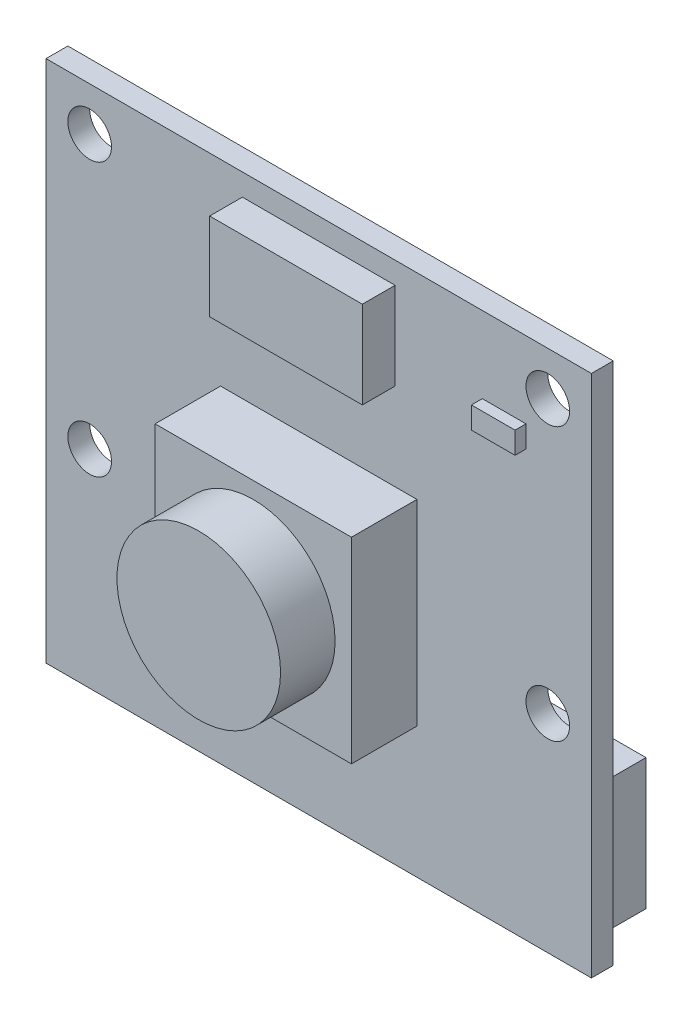
ISO-10303-21;
HEADER;
FILE_DESCRIPTION(('STEP AP214'),'2;1');
FILE_NAME('part.step','',(''),(''),'','','');
FILE_SCHEMA(('AUTOMOTIVE_DESIGN { 1 0 10303 214 1 1 1 1 }'));
ENDSEC;
DATA;
#1=APPLICATION_CONTEXT('core data for automotive mechanical design processes');
#2=APPLICATION_PROTOCOL_DEFINITION('international standard','automotive_design',2000,#1);
#3=PRODUCT_CONTEXT('',#1,'mechanical');
#4=PRODUCT('Part','Part','',(#3));
#5=PRODUCT_RELATED_PRODUCT_CATEGORY('part','',(#4));
#6=PRODUCT_DEFINITION_FORMATION('','',#4);
#7=PRODUCT_DEFINITION_CONTEXT('part definition',#1,'design');
#8=PRODUCT_DEFINITION('design','',#6,#7);
#9=PRODUCT_DEFINITION_SHAPE('','',#8);
#10=(LENGTH_UNIT() NAMED_UNIT(*) SI_UNIT(.MILLI.,.METRE.));
#11=(NAMED_UNIT(*) PLANE_ANGLE_UNIT() SI_UNIT($,.RADIAN.));
#12=(NAMED_UNIT(*) SI_UNIT($,.STERADIAN.) SOLID_ANGLE_UNIT());
#13=UNCERTAINTY_MEASURE_WITH_UNIT(LENGTH_MEASURE(1.E-05),#10,'distance_accuracy_value','');
#14=(GEOMETRIC_REPRESENTATION_CONTEXT(3) GLOBAL_UNCERTAINTY_ASSIGNED_CONTEXT((#13)) GLOBAL_UNIT_ASSIGNED_CONTEXT((#10,
#11,#12)) REPRESENTATION_CONTEXT('',''));
#15=CARTESIAN_POINT('',(0.,0.,0.));
#16=DIRECTION('',(0.,0.,1.));
#17=DIRECTION('',(1.,0.,0.));
#18=AXIS2_PLACEMENT_3D('',#15,#16,#17);
#19=CARTESIAN_POINT('',(0.,0.,0.));
#20=DIRECTION('',(0.,0.,1.));
#21=DIRECTION('',(1.,0.,0.));
#22=AXIS2_PLACEMENT_3D('',#19,#20,#21);
#23=PLANE('',#22);
#24=CARTESIAN_POINT('',(13.65,-1.3,0.));
#25=DIRECTION('',(0.,0.,1.));
#26=DIRECTION('',(1.,0.,0.));
#27=AXIS2_PLACEMENT_3D('',#24,#25,#26);
#28=CIRCLE('',#27,1.3);
#29=CARTESIAN_POINT('',(14.95,-1.3,0.));
#30=VERTEX_POINT('',#29);
#31=EDGE_CURVE('E317',#30,#30,#28,.T.);
#32=ORIENTED_EDGE('',*,*,#31,.T.);
#33=EDGE_LOOP('',(#32));
#34=FACE_BOUND('',#33,.T.);
#35=CARTESIAN_POINT('',(-13.65,-1.3,0.));
#36=DIRECTION('',(0.,0.,1.));
#37=DIRECTION('',(1.,0.,0.));
#38=AXIS2_PLACEMENT_3D('',#35,#36,#37);
#39=CIRCLE('',#38,1.3);
#40=CARTESIAN_POINT('',(-12.35,-1.3,0.));
#41=VERTEX_POINT('',#40);
#42=EDGE_CURVE('E345',#41,#41,#39,.T.);
#43=ORIENTED_EDGE('',*,*,#42,.T.);
#44=EDGE_LOOP('',(#43));
#45=FACE_BOUND('',#44,.T.);
#46=CARTESIAN_POINT('',(13.65,14.95,0.));
#47=DIRECTION('',(0.,0.,1.));
#48=DIRECTION('',(1.,0.,0.));
#49=AXIS2_PLACEMENT_3D('',#46,#47,#48);
#50=CIRCLE('',#49,1.3);
#51=CARTESIAN_POINT('',(14.95,14.95,0.));
#52=VERTEX_POINT('',#51);
#53=EDGE_CURVE('E348',#52,#52,#50,.T.);
#54=ORIENTED_EDGE('',*,*,#53,.T.);
#55=EDGE_LOOP('',(#54));
#56=FACE_BOUND('',#55,.T.);
#57=CARTESIAN_POINT('',(-13.65,14.95,0.));
#58=DIRECTION('',(0.,0.,1.));
#59=DIRECTION('',(1.,0.,0.));
#60=AXIS2_PLACEMENT_3D('',#57,#58,#59);
#61=CIRCLE('',#60,1.3);
#62=CARTESIAN_POINT('',(-12.35,14.95,0.));
#63=VERTEX_POINT('',#62);
#64=EDGE_CURVE('E351',#63,#63,#61,.T.);
#65=ORIENTED_EDGE('',*,*,#64,.T.);
#66=EDGE_LOOP('',(#65));
#67=FACE_BOUND('',#66,.T.);
#68=DIRECTION('',(0.,-1.,0.));
#69=VECTOR('',#68,1.);
#70=CARTESIAN_POINT('',(14.3,-13.65,0.));
#71=LINE('',#70,#69);
#72=CARTESIAN_POINT('',(14.3,-5.85,0.));
#73=VERTEX_POINT('',#72);
#74=CARTESIAN_POINT('',(14.3,-13.65,0.));
#75=VERTEX_POINT('',#74);
#76=EDGE_CURVE('E67',#73,#75,#71,.T.);
#77=ORIENTED_EDGE('',*,*,#76,.F.);
#78=DIRECTION('',(1.,0.,0.));
#79=VECTOR('',#78,1.);
#80=CARTESIAN_POINT('',(14.3,-5.85,0.));
#81=LINE('',#80,#79);
#82=CARTESIAN_POINT('',(-14.3,-5.85,0.));
#83=VERTEX_POINT('',#82);
#84=EDGE_CURVE('E207',#83,#73,#81,.T.);
#85=ORIENTED_EDGE('',*,*,#84,.F.);
#86=DIRECTION('',(0.,1.,0.));
#87=VECTOR('',#86,1.);
#88=CARTESIAN_POINT('',(-14.3,-13.65,0.));
#89=LINE('',#88,#87);
#90=CARTESIAN_POINT('',(-14.3,-13.65,0.));
#91=VERTEX_POINT('',#90);
#92=EDGE_CURVE('E386',#91,#83,#89,.T.);
#93=ORIENTED_EDGE('',*,*,#92,.F.);
#94=DIRECTION('',(1.,0.,0.));
#95=VECTOR('',#94,1.);
#96=CARTESIAN_POINT('',(0.,-13.65,0.));
#97=LINE('',#96,#95);
#98=CARTESIAN_POINT('',(-16.25,-13.65,0.));
#99=VERTEX_POINT('',#98);
#100=EDGE_CURVE('E354',#99,#91,#97,.T.);
#101=ORIENTED_EDGE('',*,*,#100,.F.);
#102=DIRECTION('',(0.,1.,0.));
#103=VECTOR('',#102,1.);
#104=CARTESIAN_POINT('',(-16.25,0.,0.));
#105=LINE('',#104,#103);
#106=CARTESIAN_POINT('',(-16.25,17.55,0.));
#107=VERTEX_POINT('',#106);
#108=EDGE_CURVE('E322',#99,#107,#105,.T.);
#109=ORIENTED_EDGE('',*,*,#108,.T.);
#110=DIRECTION('',(1.,0.,0.));
#111=VECTOR('',#110,1.);
#112=CARTESIAN_POINT('',(0.,17.55,0.));
#113=LINE('',#112,#111);
#114=CARTESIAN_POINT('',(16.25,17.55,0.));
#115=VERTEX_POINT('',#114);
#116=EDGE_CURVE('E359',#107,#115,#113,.T.);
#117=ORIENTED_EDGE('',*,*,#116,.T.);
#118=DIRECTION('',(0.,1.,0.));
#119=VECTOR('',#118,1.);
#120=CARTESIAN_POINT('',(16.25,0.,0.));
#121=LINE('',#120,#119);
#122=CARTESIAN_POINT('',(16.25,-13.65,0.));
#123=VERTEX_POINT('',#122);
#124=EDGE_CURVE('E356',#123,#115,#121,.T.);
#125=ORIENTED_EDGE('',*,*,#124,.F.);
#126=EDGE_CURVE('E72',#75,#123,#97,.T.);
#127=ORIENTED_EDGE('',*,*,#126,.F.);
#128=EDGE_LOOP('',(#77,#85,#93,#101,#109,#117,#125,#127));
#129=FACE_BOUND('',#128,.T.);
#130=ADVANCED_FACE('F51',(#34,#45,#56,#67,#129),#23,.F.);
#131=CARTESIAN_POINT('',(0.,0.,1.3));
#132=DIRECTION('',(0.,0.,1.));
#133=DIRECTION('',(1.,0.,0.));
#134=AXIS2_PLACEMENT_3D('',#131,#132,#133);
#135=PLANE('',#134);
#136=CARTESIAN_POINT('',(13.65,-1.3,1.3));
#137=DIRECTION('',(0.,0.,1.));
#138=DIRECTION('',(1.,0.,0.));
#139=AXIS2_PLACEMENT_3D('',#136,#137,#138);
#140=CIRCLE('',#139,1.3);
#141=CARTESIAN_POINT('',(14.95,-1.3,1.3));
#142=VERTEX_POINT('',#141);
#143=EDGE_CURVE('E318',#142,#142,#140,.T.);
#144=ORIENTED_EDGE('',*,*,#143,.F.);
#145=EDGE_LOOP('',(#144));
#146=FACE_BOUND('',#145,.T.);
#147=CARTESIAN_POINT('',(-13.65,-1.3,1.3));
#148=DIRECTION('',(0.,0.,1.));
#149=DIRECTION('',(1.,0.,0.));
#150=AXIS2_PLACEMENT_3D('',#147,#148,#149);
#151=CIRCLE('',#150,1.3);
#152=CARTESIAN_POINT('',(-12.35,-1.3,1.3));
#153=VERTEX_POINT('',#152);
#154=EDGE_CURVE('E321',#153,#153,#151,.T.);
#155=ORIENTED_EDGE('',*,*,#154,.F.);
#156=EDGE_LOOP('',(#155));
#157=FACE_BOUND('',#156,.T.);
#158=CARTESIAN_POINT('',(13.65,14.95,1.3));
#159=DIRECTION('',(0.,0.,1.));
#160=DIRECTION('',(1.,0.,0.));
#161=AXIS2_PLACEMENT_3D('',#158,#159,#160);
#162=CIRCLE('',#161,1.3);
#163=CARTESIAN_POINT('',(14.95,14.95,1.3));
#164=VERTEX_POINT('',#163);
#165=EDGE_CURVE('E325',#164,#164,#162,.T.);
#166=ORIENTED_EDGE('',*,*,#165,.F.);
#167=EDGE_LOOP('',(#166));
#168=FACE_BOUND('',#167,.T.);
#169=CARTESIAN_POINT('',(-13.65,14.95,1.3));
#170=DIRECTION('',(0.,0.,1.));
#171=DIRECTION('',(1.,0.,0.));
#172=AXIS2_PLACEMENT_3D('',#169,#170,#171);
#173=CIRCLE('',#172,1.3);
#174=CARTESIAN_POINT('',(-12.35,14.95,1.3));
#175=VERTEX_POINT('',#174);
#176=EDGE_CURVE('E328',#175,#175,#173,.T.);
#177=ORIENTED_EDGE('',*,*,#176,.F.);
#178=EDGE_LOOP('',(#177));
#179=FACE_BOUND('',#178,.T.);
#180=DIRECTION('',(1.,0.,0.));
#181=VECTOR('',#180,1.);
#182=CARTESIAN_POINT('',(0.,-13.65,1.3));
#183=LINE('',#182,#181);
#184=CARTESIAN_POINT('',(-16.25,-13.65,1.3));
#185=VERTEX_POINT('',#184);
#186=CARTESIAN_POINT('',(16.25,-13.65,1.3));
#187=VERTEX_POINT('',#186);
#188=EDGE_CURVE('E331',#185,#187,#183,.T.);
#189=ORIENTED_EDGE('',*,*,#188,.T.);
#190=DIRECTION('',(0.,1.,0.));
#191=VECTOR('',#190,1.);
#192=CARTESIAN_POINT('',(16.25,0.,1.3));
#193=LINE('',#192,#191);
#194=CARTESIAN_POINT('',(16.25,17.55,1.3));
#195=VERTEX_POINT('',#194);
#196=EDGE_CURVE('E334',#187,#195,#193,.T.);
#197=ORIENTED_EDGE('',*,*,#196,.T.);
#198=DIRECTION('',(1.,0.,0.));
#199=VECTOR('',#198,1.);
#200=CARTESIAN_POINT('',(0.,17.55,1.3));
#201=LINE('',#200,#199);
#202=CARTESIAN_POINT('',(-16.25,17.55,1.3));
#203=VERTEX_POINT('',#202);
#204=EDGE_CURVE('E336',#203,#195,#201,.T.);
#205=ORIENTED_EDGE('',*,*,#204,.F.);
#206=DIRECTION('',(0.,1.,0.));
#207=VECTOR('',#206,1.);
#208=CARTESIAN_POINT('',(-16.25,0.,1.3));
#209=LINE('',#208,#207);
#210=EDGE_CURVE('E339',#185,#203,#209,.T.);
#211=ORIENTED_EDGE('',*,*,#210,.F.);
#212=EDGE_LOOP('',(#189,#197,#205,#211));
#213=FACE_BOUND('',#212,.T.);
#214=DIRECTION('',(0.,-1.,0.));
#215=VECTOR('',#214,1.);
#216=CARTESIAN_POINT('',(12.35,0.,1.3));
#217=LINE('',#216,#215);
#218=CARTESIAN_POINT('',(12.35,13.,1.3));
#219=VERTEX_POINT('',#218);
#220=CARTESIAN_POINT('',(12.35,11.7,1.3));
#221=VERTEX_POINT('',#220);
#222=EDGE_CURVE('E313',#219,#221,#217,.T.);
#223=ORIENTED_EDGE('',*,*,#222,.T.);
#224=DIRECTION('',(-1.,0.,0.));
#225=VECTOR('',#224,1.);
#226=CARTESIAN_POINT('',(0.,11.7,1.3));
#227=LINE('',#226,#225);
#228=CARTESIAN_POINT('',(9.75000000000001,11.7,1.3));
#229=VERTEX_POINT('',#228);
#230=EDGE_CURVE('E315',#221,#229,#227,.T.);
#231=ORIENTED_EDGE('',*,*,#230,.T.);
#232=DIRECTION('',(0.,-1.,0.));
#233=VECTOR('',#232,1.);
#234=CARTESIAN_POINT('',(9.75000000000001,0.,1.3));
#235=LINE('',#234,#233);
#236=CARTESIAN_POINT('',(9.75000000000001,13.,1.3));
#237=VERTEX_POINT('',#236);
#238=EDGE_CURVE('E307',#237,#229,#235,.T.);
#239=ORIENTED_EDGE('',*,*,#238,.F.);
#240=DIRECTION('',(-1.,0.,0.));
#241=VECTOR('',#240,1.);
#242=CARTESIAN_POINT('',(0.,13.,1.3));
#243=LINE('',#242,#241);
#244=EDGE_CURVE('E310',#219,#237,#243,.T.);
#245=ORIENTED_EDGE('',*,*,#244,.F.);
#246=EDGE_LOOP('',(#223,#231,#239,#245));
#247=FACE_BOUND('',#246,.T.);
#248=DIRECTION('',(0.,-1.,0.));
#249=VECTOR('',#248,1.);
#250=CARTESIAN_POINT('',(4.55,0.,1.3));
#251=LINE('',#250,#249);
#252=CARTESIAN_POINT('',(4.55,16.25,1.3));
#253=VERTEX_POINT('',#252);
#254=CARTESIAN_POINT('',(4.55,11.05,1.3));
#255=VERTEX_POINT('',#254);
#256=EDGE_CURVE('E280',#253,#255,#251,.T.);
#257=ORIENTED_EDGE('',*,*,#256,.T.);
#258=DIRECTION('',(-1.,0.,0.));
#259=VECTOR('',#258,1.);
#260=CARTESIAN_POINT('',(0.,11.05,1.3));
#261=LINE('',#260,#259);
#262=CARTESIAN_POINT('',(-4.55,11.05,1.3));
#263=VERTEX_POINT('',#262);
#264=EDGE_CURVE('E282',#255,#263,#261,.T.);
#265=ORIENTED_EDGE('',*,*,#264,.T.);
#266=DIRECTION('',(0.,-1.,0.));
#267=VECTOR('',#266,1.);
#268=CARTESIAN_POINT('',(-4.55,0.,1.3));
#269=LINE('',#268,#267);
#270=CARTESIAN_POINT('',(-4.55,16.25,1.3));
#271=VERTEX_POINT('',#270);
#272=EDGE_CURVE('E274',#271,#263,#269,.T.);
#273=ORIENTED_EDGE('',*,*,#272,.F.);
#274=DIRECTION('',(-1.,0.,0.));
#275=VECTOR('',#274,1.);
#276=CARTESIAN_POINT('',(0.,16.25,1.3));
#277=LINE('',#276,#275);
#278=EDGE_CURVE('E277',#253,#271,#277,.T.);
#279=ORIENTED_EDGE('',*,*,#278,.F.);
#280=EDGE_LOOP('',(#257,#265,#273,#279));
#281=FACE_BOUND('',#280,.T.);
#282=DIRECTION('',(0.,-1.,0.));
#283=VECTOR('',#282,1.);
#284=CARTESIAN_POINT('',(5.85,0.,1.3));
#285=LINE('',#284,#283);
#286=CARTESIAN_POINT('',(5.85,5.85,1.3));
#287=VERTEX_POINT('',#286);
#288=CARTESIAN_POINT('',(5.85,-5.85,1.3));
#289=VERTEX_POINT('',#288);
#290=EDGE_CURVE('E247',#287,#289,#285,.T.);
#291=ORIENTED_EDGE('',*,*,#290,.T.);
#292=DIRECTION('',(-1.,0.,0.));
#293=VECTOR('',#292,1.);
#294=CARTESIAN_POINT('',(0.,-5.85,1.3));
#295=LINE('',#294,#293);
#296=CARTESIAN_POINT('',(-5.85,-5.85,1.3));
#297=VERTEX_POINT('',#296);
#298=EDGE_CURVE('E249',#289,#297,#295,.T.);
#299=ORIENTED_EDGE('',*,*,#298,.T.);
#300=DIRECTION('',(0.,-1.,0.));
#301=VECTOR('',#300,1.);
#302=CARTESIAN_POINT('',(-5.85,0.,1.3));
#303=LINE('',#302,#301);
#304=CARTESIAN_POINT('',(-5.85,5.85,1.3));
#305=VERTEX_POINT('',#304);
#306=EDGE_CURVE('E241',#305,#297,#303,.T.);
#307=ORIENTED_EDGE('',*,*,#306,.F.);
#308=DIRECTION('',(-1.,0.,0.));
#309=VECTOR('',#308,1.);
#310=CARTESIAN_POINT('',(0.,5.85,1.3));
#311=LINE('',#310,#309);
#312=EDGE_CURVE('E244',#287,#305,#311,.T.);
#313=ORIENTED_EDGE('',*,*,#312,.F.);
#314=EDGE_LOOP('',(#291,#299,#307,#313));
#315=FACE_BOUND('',#314,.T.);
#316=ADVANCED_FACE('F382',(#146,#157,#168,#179,#213,#247,#281,#315),#135,.T.);
#317=CARTESIAN_POINT('',(0.,-13.65,1.3));
#318=DIRECTION('',(0.,1.,0.));
#319=DIRECTION('',(0.,0.,1.));
#320=AXIS2_PLACEMENT_3D('',#317,#318,#319);
#321=PLANE('',#320);
#322=ORIENTED_EDGE('',*,*,#100,.T.);
#323=DIRECTION('',(0.,0.,1.));
#324=VECTOR('',#323,1.);
#325=CARTESIAN_POINT('',(-14.3,-13.65,-3.9));
#326=LINE('',#325,#324);
#327=CARTESIAN_POINT('',(-14.3,-13.65,-3.9));
#328=VERTEX_POINT('',#327);
#329=EDGE_CURVE('E194',#328,#91,#326,.T.);
#330=ORIENTED_EDGE('',*,*,#329,.F.);
#331=DIRECTION('',(-1.,0.,0.));
#332=VECTOR('',#331,1.);
#333=CARTESIAN_POINT('',(14.3,-13.65,-3.9));
#334=LINE('',#333,#332);
#335=CARTESIAN_POINT('',(14.3,-13.65,-3.9));
#336=VERTEX_POINT('',#335);
#337=EDGE_CURVE('E187',#336,#328,#334,.T.);
#338=ORIENTED_EDGE('',*,*,#337,.F.);
#339=DIRECTION('',(0.,0.,1.));
#340=VECTOR('',#339,1.);
#341=CARTESIAN_POINT('',(14.3,-13.65,-3.9));
#342=LINE('',#341,#340);
#343=EDGE_CURVE('E192',#336,#75,#342,.T.);
#344=ORIENTED_EDGE('',*,*,#343,.T.);
#345=ORIENTED_EDGE('',*,*,#126,.T.);
#346=DIRECTION('',(0.,0.,-1.));
#347=VECTOR('',#346,1.);
#348=CARTESIAN_POINT('',(16.25,-13.65,1.3));
#349=LINE('',#348,#347);
#350=EDGE_CURVE('E55',#187,#123,#349,.T.);
#351=ORIENTED_EDGE('',*,*,#350,.F.);
#352=ORIENTED_EDGE('',*,*,#188,.F.);
#353=DIRECTION('',(0.,0.,-1.));
#354=VECTOR('',#353,1.);
#355=CARTESIAN_POINT('',(-16.25,-13.65,1.3));
#356=LINE('',#355,#354);
#357=EDGE_CURVE('E342',#185,#99,#356,.T.);
#358=ORIENTED_EDGE('',*,*,#357,.T.);
#359=EDGE_LOOP('',(#322,#330,#338,#344,#345,#351,#352,#358));
#360=FACE_BOUND('',#359,.T.);
#361=ADVANCED_FACE('F190',(#360),#321,.F.);
#362=CARTESIAN_POINT('',(16.25,0.,1.3));
#363=DIRECTION('',(-1.,0.,0.));
#364=DIRECTION('',(0.,0.,1.));
#365=AXIS2_PLACEMENT_3D('',#362,#363,#364);
#366=PLANE('',#365);
#367=ORIENTED_EDGE('',*,*,#124,.T.);
#368=DIRECTION('',(0.,0.,-1.));
#369=VECTOR('',#368,1.);
#370=CARTESIAN_POINT('',(16.25,17.55,1.3));
#371=LINE('',#370,#369);
#372=EDGE_CURVE('E366',#195,#115,#371,.T.);
#373=ORIENTED_EDGE('',*,*,#372,.F.);
#374=ORIENTED_EDGE('',*,*,#196,.F.);
#375=ORIENTED_EDGE('',*,*,#350,.T.);
#376=EDGE_LOOP('',(#367,#373,#374,#375));
#377=FACE_BOUND('',#376,.T.);
#378=ADVANCED_FACE('F373',(#377),#366,.F.);
#379=CARTESIAN_POINT('',(0.,17.55,1.3));
#380=DIRECTION('',(0.,1.,0.));
#381=DIRECTION('',(0.,0.,1.));
#382=AXIS2_PLACEMENT_3D('',#379,#380,#381);
#383=PLANE('',#382);
#384=ORIENTED_EDGE('',*,*,#116,.F.);
#385=DIRECTION('',(0.,0.,-1.));
#386=VECTOR('',#385,1.);
#387=CARTESIAN_POINT('',(-16.25,17.55,1.3));
#388=LINE('',#387,#386);
#389=EDGE_CURVE('E365',#203,#107,#388,.T.);
#390=ORIENTED_EDGE('',*,*,#389,.F.);
#391=ORIENTED_EDGE('',*,*,#204,.T.);
#392=ORIENTED_EDGE('',*,*,#372,.T.);
#393=EDGE_LOOP('',(#384,#390,#391,#392));
#394=FACE_BOUND('',#393,.T.);
#395=ADVANCED_FACE('F378',(#394),#383,.T.);
#396=CARTESIAN_POINT('',(-13.65,14.95,1.3));
#397=DIRECTION('',(0.,0.,-1.));
#398=DIRECTION('',(-1.,0.,0.));
#399=AXIS2_PLACEMENT_3D('',#396,#397,#398);
#400=CYLINDRICAL_SURFACE('',#399,1.3);
#401=ORIENTED_EDGE('',*,*,#176,.T.);
#402=EDGE_LOOP('',(#401));
#403=FACE_BOUND('',#402,.T.);
#404=ORIENTED_EDGE('',*,*,#64,.F.);
#405=EDGE_LOOP('',(#404));
#406=FACE_BOUND('',#405,.T.);
#407=ADVANCED_FACE('F425',(#403,#406),#400,.F.);
#408=CARTESIAN_POINT('',(13.65,14.95,1.3));
#409=DIRECTION('',(0.,0.,-1.));
#410=DIRECTION('',(-1.,0.,0.));
#411=AXIS2_PLACEMENT_3D('',#408,#409,#410);
#412=CYLINDRICAL_SURFACE('',#411,1.3);
#413=ORIENTED_EDGE('',*,*,#165,.T.);
#414=EDGE_LOOP('',(#413));
#415=FACE_BOUND('',#414,.T.);
#416=ORIENTED_EDGE('',*,*,#53,.F.);
#417=EDGE_LOOP('',(#416));
#418=FACE_BOUND('',#417,.T.);
#419=ADVANCED_FACE('F432',(#415,#418),#412,.F.);
#420=CARTESIAN_POINT('',(-13.65,-1.3,1.3));
#421=DIRECTION('',(0.,0.,-1.));
#422=DIRECTION('',(-1.,0.,0.));
#423=AXIS2_PLACEMENT_3D('',#420,#421,#422);
#424=CYLINDRICAL_SURFACE('',#423,1.3);
#425=ORIENTED_EDGE('',*,*,#154,.T.);
#426=EDGE_LOOP('',(#425));
#427=FACE_BOUND('',#426,.T.);
#428=ORIENTED_EDGE('',*,*,#42,.F.);
#429=EDGE_LOOP('',(#428));
#430=FACE_BOUND('',#429,.T.);
#431=ADVANCED_FACE('F435',(#427,#430),#424,.F.);
#432=CARTESIAN_POINT('',(13.65,-1.3,1.3));
#433=DIRECTION('',(0.,0.,-1.));
#434=DIRECTION('',(-1.,0.,0.));
#435=AXIS2_PLACEMENT_3D('',#432,#433,#434);
#436=CYLINDRICAL_SURFACE('',#435,1.3);
#437=ORIENTED_EDGE('',*,*,#143,.T.);
#438=EDGE_LOOP('',(#437));
#439=FACE_BOUND('',#438,.T.);
#440=ORIENTED_EDGE('',*,*,#31,.F.);
#441=EDGE_LOOP('',(#440));
#442=FACE_BOUND('',#441,.T.);
#443=ADVANCED_FACE('F53',(#439,#442),#436,.F.);
#444=CARTESIAN_POINT('',(-16.25,0.,1.3));
#445=DIRECTION('',(-1.,0.,0.));
#446=DIRECTION('',(0.,0.,1.));
#447=AXIS2_PLACEMENT_3D('',#444,#445,#446);
#448=PLANE('',#447);
#449=ORIENTED_EDGE('',*,*,#108,.F.);
#450=ORIENTED_EDGE('',*,*,#357,.F.);
#451=ORIENTED_EDGE('',*,*,#210,.T.);
#452=ORIENTED_EDGE('',*,*,#389,.T.);
#453=EDGE_LOOP('',(#449,#450,#451,#452));
#454=FACE_BOUND('',#453,.T.);
#455=ADVANCED_FACE('F384',(#454),#448,.T.);
#456=CARTESIAN_POINT('',(0.,11.7,1.95));
#457=DIRECTION('',(0.,1.,0.));
#458=DIRECTION('',(0.,0.,1.));
#459=AXIS2_PLACEMENT_3D('',#456,#457,#458);
#460=PLANE('',#459);
#461=ORIENTED_EDGE('',*,*,#230,.F.);
#462=DIRECTION('',(0.,0.,-1.));
#463=VECTOR('',#462,1.);
#464=CARTESIAN_POINT('',(12.35,11.7,1.95));
#465=LINE('',#464,#463);
#466=CARTESIAN_POINT('',(12.35,11.7,1.95));
#467=VERTEX_POINT('',#466);
#468=EDGE_CURVE('E304',#467,#221,#465,.T.);
#469=ORIENTED_EDGE('',*,*,#468,.F.);
#470=DIRECTION('',(1.,0.,0.));
#471=VECTOR('',#470,1.);
#472=CARTESIAN_POINT('',(0.,11.7,1.95));
#473=LINE('',#472,#471);
#474=CARTESIAN_POINT('',(9.75000000000001,11.7,1.95));
#475=VERTEX_POINT('',#474);
#476=EDGE_CURVE('E284',#475,#467,#473,.T.);
#477=ORIENTED_EDGE('',*,*,#476,.F.);
#478=DIRECTION('',(0.,0.,-1.));
#479=VECTOR('',#478,1.);
#480=CARTESIAN_POINT('',(9.75000000000001,11.7,1.95));
#481=LINE('',#480,#479);
#482=EDGE_CURVE('E295',#475,#229,#481,.T.);
#483=ORIENTED_EDGE('',*,*,#482,.T.);
#484=EDGE_LOOP('',(#461,#469,#477,#483));
#485=FACE_BOUND('',#484,.T.);
#486=ADVANCED_FACE('F422',(#485),#460,.F.);
#487=CARTESIAN_POINT('',(12.35,0.,1.95));
#488=DIRECTION('',(-1.,0.,0.));
#489=DIRECTION('',(0.,0.,1.));
#490=AXIS2_PLACEMENT_3D('',#487,#488,#489);
#491=PLANE('',#490);
#492=ORIENTED_EDGE('',*,*,#222,.F.);
#493=DIRECTION('',(0.,0.,-1.));
#494=VECTOR('',#493,1.);
#495=CARTESIAN_POINT('',(12.35,13.,1.95));
#496=LINE('',#495,#494);
#497=CARTESIAN_POINT('',(12.35,13.,1.95));
#498=VERTEX_POINT('',#497);
#499=EDGE_CURVE('E301',#498,#219,#496,.T.);
#500=ORIENTED_EDGE('',*,*,#499,.F.);
#501=DIRECTION('',(0.,1.,0.));
#502=VECTOR('',#501,1.);
#503=CARTESIAN_POINT('',(12.35,0.,1.95));
#504=LINE('',#503,#502);
#505=EDGE_CURVE('E287',#467,#498,#504,.T.);
#506=ORIENTED_EDGE('',*,*,#505,.F.);
#507=ORIENTED_EDGE('',*,*,#468,.T.);
#508=EDGE_LOOP('',(#492,#500,#506,#507));
#509=FACE_BOUND('',#508,.T.);
#510=ADVANCED_FACE('F472',(#509),#491,.F.);
#511=CARTESIAN_POINT('',(0.,13.,1.95));
#512=DIRECTION('',(0.,1.,0.));
#513=DIRECTION('',(0.,0.,1.));
#514=AXIS2_PLACEMENT_3D('',#511,#512,#513);
#515=PLANE('',#514);
#516=ORIENTED_EDGE('',*,*,#499,.T.);
#517=ORIENTED_EDGE('',*,*,#244,.T.);
#518=DIRECTION('',(0.,0.,-1.));
#519=VECTOR('',#518,1.);
#520=CARTESIAN_POINT('',(9.75000000000001,13.,1.95));
#521=LINE('',#520,#519);
#522=CARTESIAN_POINT('',(9.75000000000001,13.,1.95));
#523=VERTEX_POINT('',#522);
#524=EDGE_CURVE('E298',#523,#237,#521,.T.);
#525=ORIENTED_EDGE('',*,*,#524,.F.);
#526=DIRECTION('',(1.,0.,0.));
#527=VECTOR('',#526,1.);
#528=CARTESIAN_POINT('',(0.,13.,1.95));
#529=LINE('',#528,#527);
#530=EDGE_CURVE('E289',#523,#498,#529,.T.);
#531=ORIENTED_EDGE('',*,*,#530,.T.);
#532=EDGE_LOOP('',(#516,#517,#525,#531));
#533=FACE_BOUND('',#532,.T.);
#534=ADVANCED_FACE('F479',(#533),#515,.T.);
#535=CARTESIAN_POINT('',(9.75000000000001,0.,1.95));
#536=DIRECTION('',(-1.,0.,0.));
#537=DIRECTION('',(0.,0.,1.));
#538=AXIS2_PLACEMENT_3D('',#535,#536,#537);
#539=PLANE('',#538);
#540=ORIENTED_EDGE('',*,*,#524,.T.);
#541=ORIENTED_EDGE('',*,*,#238,.T.);
#542=ORIENTED_EDGE('',*,*,#482,.F.);
#543=DIRECTION('',(0.,1.,0.));
#544=VECTOR('',#543,1.);
#545=CARTESIAN_POINT('',(9.75000000000001,0.,1.95));
#546=LINE('',#545,#544);
#547=EDGE_CURVE('E292',#475,#523,#546,.T.);
#548=ORIENTED_EDGE('',*,*,#547,.T.);
#549=EDGE_LOOP('',(#540,#541,#542,#548));
#550=FACE_BOUND('',#549,.T.);
#551=ADVANCED_FACE('F487',(#550),#539,.T.);
#552=CARTESIAN_POINT('',(0.,0.,1.95));
#553=DIRECTION('',(0.,0.,1.));
#554=DIRECTION('',(1.,0.,0.));
#555=AXIS2_PLACEMENT_3D('',#552,#553,#554);
#556=PLANE('',#555);
#557=ORIENTED_EDGE('',*,*,#476,.T.);
#558=ORIENTED_EDGE('',*,*,#505,.T.);
#559=ORIENTED_EDGE('',*,*,#530,.F.);
#560=ORIENTED_EDGE('',*,*,#547,.F.);
#561=EDGE_LOOP('',(#557,#558,#559,#560));
#562=FACE_BOUND('',#561,.T.);
#563=ADVANCED_FACE('F495',(#562),#556,.T.);
#564=CARTESIAN_POINT('',(0.,11.05,3.25));
#565=DIRECTION('',(0.,1.,0.));
#566=DIRECTION('',(0.,0.,1.));
#567=AXIS2_PLACEMENT_3D('',#564,#565,#566);
#568=PLANE('',#567);
#569=ORIENTED_EDGE('',*,*,#264,.F.);
#570=DIRECTION('',(0.,0.,-1.));
#571=VECTOR('',#570,1.);
#572=CARTESIAN_POINT('',(4.55,11.05,3.25));
#573=LINE('',#572,#571);
#574=CARTESIAN_POINT('',(4.55,11.05,3.25));
#575=VERTEX_POINT('',#574);
#576=EDGE_CURVE('E271',#575,#255,#573,.T.);
#577=ORIENTED_EDGE('',*,*,#576,.F.);
#578=DIRECTION('',(1.,0.,0.));
#579=VECTOR('',#578,1.);
#580=CARTESIAN_POINT('',(0.,11.05,3.25));
#581=LINE('',#580,#579);
#582=CARTESIAN_POINT('',(-4.55,11.05,3.25));
#583=VERTEX_POINT('',#582);
#584=EDGE_CURVE('E251',#583,#575,#581,.T.);
#585=ORIENTED_EDGE('',*,*,#584,.F.);
#586=DIRECTION('',(0.,0.,-1.));
#587=VECTOR('',#586,1.);
#588=CARTESIAN_POINT('',(-4.55,11.05,3.25));
#589=LINE('',#588,#587);
#590=EDGE_CURVE('E262',#583,#263,#589,.T.);
#591=ORIENTED_EDGE('',*,*,#590,.T.);
#592=EDGE_LOOP('',(#569,#577,#585,#591));
#593=FACE_BOUND('',#592,.T.);
#594=ADVANCED_FACE('F503',(#593),#568,.F.);
#595=CARTESIAN_POINT('',(4.55,0.,3.25));
#596=DIRECTION('',(-1.,0.,0.));
#597=DIRECTION('',(0.,0.,1.));
#598=AXIS2_PLACEMENT_3D('',#595,#596,#597);
#599=PLANE('',#598);
#600=ORIENTED_EDGE('',*,*,#256,.F.);
#601=DIRECTION('',(0.,0.,-1.));
#602=VECTOR('',#601,1.);
#603=CARTESIAN_POINT('',(4.55,16.25,3.25));
#604=LINE('',#603,#602);
#605=CARTESIAN_POINT('',(4.55,16.25,3.25));
#606=VERTEX_POINT('',#605);
#607=EDGE_CURVE('E268',#606,#253,#604,.T.);
#608=ORIENTED_EDGE('',*,*,#607,.F.);
#609=DIRECTION('',(0.,1.,0.));
#610=VECTOR('',#609,1.);
#611=CARTESIAN_POINT('',(4.55,0.,3.25));
#612=LINE('',#611,#610);
#613=EDGE_CURVE('E254',#575,#606,#612,.T.);
#614=ORIENTED_EDGE('',*,*,#613,.F.);
#615=ORIENTED_EDGE('',*,*,#576,.T.);
#616=EDGE_LOOP('',(#600,#608,#614,#615));
#617=FACE_BOUND('',#616,.T.);
#618=ADVANCED_FACE('F511',(#617),#599,.F.);
#619=CARTESIAN_POINT('',(0.,16.25,3.25));
#620=DIRECTION('',(0.,1.,0.));
#621=DIRECTION('',(0.,0.,1.));
#622=AXIS2_PLACEMENT_3D('',#619,#620,#621);
#623=PLANE('',#622);
#624=ORIENTED_EDGE('',*,*,#607,.T.);
#625=ORIENTED_EDGE('',*,*,#278,.T.);
#626=DIRECTION('',(0.,0.,-1.));
#627=VECTOR('',#626,1.);
#628=CARTESIAN_POINT('',(-4.55,16.25,3.25));
#629=LINE('',#628,#627);
#630=CARTESIAN_POINT('',(-4.55,16.25,3.25));
#631=VERTEX_POINT('',#630);
#632=EDGE_CURVE('E265',#631,#271,#629,.T.);
#633=ORIENTED_EDGE('',*,*,#632,.F.);
#634=DIRECTION('',(1.,0.,0.));
#635=VECTOR('',#634,1.);
#636=CARTESIAN_POINT('',(0.,16.25,3.25));
#637=LINE('',#636,#635);
#638=EDGE_CURVE('E256',#631,#606,#637,.T.);
#639=ORIENTED_EDGE('',*,*,#638,.T.);
#640=EDGE_LOOP('',(#624,#625,#633,#639));
#641=FACE_BOUND('',#640,.T.);
#642=ADVANCED_FACE('F519',(#641),#623,.T.);
#643=CARTESIAN_POINT('',(-4.55,0.,3.25));
#644=DIRECTION('',(-1.,0.,0.));
#645=DIRECTION('',(0.,0.,1.));
#646=AXIS2_PLACEMENT_3D('',#643,#644,#645);
#647=PLANE('',#646);
#648=ORIENTED_EDGE('',*,*,#632,.T.);
#649=ORIENTED_EDGE('',*,*,#272,.T.);
#650=ORIENTED_EDGE('',*,*,#590,.F.);
#651=DIRECTION('',(0.,1.,0.));
#652=VECTOR('',#651,1.);
#653=CARTESIAN_POINT('',(-4.55,0.,3.25));
#654=LINE('',#653,#652);
#655=EDGE_CURVE('E259',#583,#631,#654,.T.);
#656=ORIENTED_EDGE('',*,*,#655,.T.);
#657=EDGE_LOOP('',(#648,#649,#650,#656));
#658=FACE_BOUND('',#657,.T.);
#659=ADVANCED_FACE('F527',(#658),#647,.T.);
#660=CARTESIAN_POINT('',(0.,0.,3.25));
#661=DIRECTION('',(0.,0.,1.));
#662=DIRECTION('',(1.,0.,0.));
#663=AXIS2_PLACEMENT_3D('',#660,#661,#662);
#664=PLANE('',#663);
#665=ORIENTED_EDGE('',*,*,#584,.T.);
#666=ORIENTED_EDGE('',*,*,#613,.T.);
#667=ORIENTED_EDGE('',*,*,#638,.F.);
#668=ORIENTED_EDGE('',*,*,#655,.F.);
#669=EDGE_LOOP('',(#665,#666,#667,#668));
#670=FACE_BOUND('',#669,.T.);
#671=ADVANCED_FACE('F535',(#670),#664,.T.);
#672=CARTESIAN_POINT('',(0.,-5.85,5.2));
#673=DIRECTION('',(0.,1.,0.));
#674=DIRECTION('',(0.,0.,1.));
#675=AXIS2_PLACEMENT_3D('',#672,#673,#674);
#676=PLANE('',#675);
#677=ORIENTED_EDGE('',*,*,#298,.F.);
#678=DIRECTION('',(0.,0.,-1.));
#679=VECTOR('',#678,1.);
#680=CARTESIAN_POINT('',(5.85,-5.85,5.2));
#681=LINE('',#680,#679);
#682=CARTESIAN_POINT('',(5.85,-5.85,5.2));
#683=VERTEX_POINT('',#682);
#684=EDGE_CURVE('E238',#683,#289,#681,.T.);
#685=ORIENTED_EDGE('',*,*,#684,.F.);
#686=DIRECTION('',(1.,0.,0.));
#687=VECTOR('',#686,1.);
#688=CARTESIAN_POINT('',(0.,-5.85,5.2));
#689=LINE('',#688,#687);
#690=CARTESIAN_POINT('',(-5.85,-5.85,5.2));
#691=VERTEX_POINT('',#690);
#692=EDGE_CURVE('E213',#691,#683,#689,.T.);
#693=ORIENTED_EDGE('',*,*,#692,.F.);
#694=DIRECTION('',(0.,0.,-1.));
#695=VECTOR('',#694,1.);
#696=CARTESIAN_POINT('',(-5.85,-5.85,5.2));
#697=LINE('',#696,#695);
#698=EDGE_CURVE('E229',#691,#297,#697,.T.);
#699=ORIENTED_EDGE('',*,*,#698,.T.);
#700=EDGE_LOOP('',(#677,#685,#693,#699));
#701=FACE_BOUND('',#700,.T.);
#702=ADVANCED_FACE('F543',(#701),#676,.F.);
#703=CARTESIAN_POINT('',(5.85,0.,5.2));
#704=DIRECTION('',(-1.,0.,0.));
#705=DIRECTION('',(0.,0.,1.));
#706=AXIS2_PLACEMENT_3D('',#703,#704,#705);
#707=PLANE('',#706);
#708=ORIENTED_EDGE('',*,*,#290,.F.);
#709=DIRECTION('',(0.,0.,-1.));
#710=VECTOR('',#709,1.);
#711=CARTESIAN_POINT('',(5.85,5.85,5.2));
#712=LINE('',#711,#710);
#713=CARTESIAN_POINT('',(5.85,5.85,5.2));
#714=VERTEX_POINT('',#713);
#715=EDGE_CURVE('E235',#714,#287,#712,.T.);
#716=ORIENTED_EDGE('',*,*,#715,.F.);
#717=DIRECTION('',(0.,1.,0.));
#718=VECTOR('',#717,1.);
#719=CARTESIAN_POINT('',(5.85,0.,5.2));
#720=LINE('',#719,#718);
#721=EDGE_CURVE('E221',#683,#714,#720,.T.);
#722=ORIENTED_EDGE('',*,*,#721,.F.);
#723=ORIENTED_EDGE('',*,*,#684,.T.);
#724=EDGE_LOOP('',(#708,#716,#722,#723));
#725=FACE_BOUND('',#724,.T.);
#726=ADVANCED_FACE('F551',(#725),#707,.F.);
#727=CARTESIAN_POINT('',(0.,5.85,5.2));
#728=DIRECTION('',(0.,1.,0.));
#729=DIRECTION('',(0.,0.,1.));
#730=AXIS2_PLACEMENT_3D('',#727,#728,#729);
#731=PLANE('',#730);
#732=ORIENTED_EDGE('',*,*,#715,.T.);
#733=ORIENTED_EDGE('',*,*,#312,.T.);
#734=DIRECTION('',(0.,0.,-1.));
#735=VECTOR('',#734,1.);
#736=CARTESIAN_POINT('',(-5.85,5.85,5.2));
#737=LINE('',#736,#735);
#738=CARTESIAN_POINT('',(-5.85,5.85,5.2));
#739=VERTEX_POINT('',#738);
#740=EDGE_CURVE('E232',#739,#305,#737,.T.);
#741=ORIENTED_EDGE('',*,*,#740,.F.);
#742=DIRECTION('',(1.,0.,0.));
#743=VECTOR('',#742,1.);
#744=CARTESIAN_POINT('',(0.,5.85,5.2));
#745=LINE('',#744,#743);
#746=EDGE_CURVE('E223',#739,#714,#745,.T.);
#747=ORIENTED_EDGE('',*,*,#746,.T.);
#748=EDGE_LOOP('',(#732,#733,#741,#747));
#749=FACE_BOUND('',#748,.T.);
#750=ADVANCED_FACE('F559',(#749),#731,.T.);
#751=CARTESIAN_POINT('',(-5.85,0.,5.2));
#752=DIRECTION('',(-1.,0.,0.));
#753=DIRECTION('',(0.,0.,1.));
#754=AXIS2_PLACEMENT_3D('',#751,#752,#753);
#755=PLANE('',#754);
#756=ORIENTED_EDGE('',*,*,#740,.T.);
#757=ORIENTED_EDGE('',*,*,#306,.T.);
#758=ORIENTED_EDGE('',*,*,#698,.F.);
#759=DIRECTION('',(0.,1.,0.));
#760=VECTOR('',#759,1.);
#761=CARTESIAN_POINT('',(-5.85,0.,5.2));
#762=LINE('',#761,#760);
#763=EDGE_CURVE('E226',#691,#739,#762,.T.);
#764=ORIENTED_EDGE('',*,*,#763,.T.);
#765=EDGE_LOOP('',(#756,#757,#758,#764));
#766=FACE_BOUND('',#765,.T.);
#767=ADVANCED_FACE('F567',(#766),#755,.T.);
#768=CARTESIAN_POINT('',(0.,0.,5.2));
#769=DIRECTION('',(0.,0.,1.));
#770=DIRECTION('',(1.,0.,0.));
#771=AXIS2_PLACEMENT_3D('',#768,#769,#770);
#772=PLANE('',#771);
#773=CARTESIAN_POINT('',(0.,0.,5.2));
#774=DIRECTION('',(0.,0.,1.));
#775=DIRECTION('',(1.,0.,0.));
#776=AXIS2_PLACEMENT_3D('',#773,#774,#775);
#777=CIRCLE('',#776,4.875);
#778=CARTESIAN_POINT('',(4.875,0.,5.2));
#779=VERTEX_POINT('',#778);
#780=EDGE_CURVE('E13',#779,#779,#777,.T.);
#781=ORIENTED_EDGE('',*,*,#780,.F.);
#782=EDGE_LOOP('',(#781));
#783=FACE_BOUND('',#782,.T.);
#784=ORIENTED_EDGE('',*,*,#692,.T.);
#785=ORIENTED_EDGE('',*,*,#721,.T.);
#786=ORIENTED_EDGE('',*,*,#746,.F.);
#787=ORIENTED_EDGE('',*,*,#763,.F.);
#788=EDGE_LOOP('',(#784,#785,#786,#787));
#789=FACE_BOUND('',#788,.T.);
#790=ADVANCED_FACE('F575',(#783,#789),#772,.T.);
#791=CARTESIAN_POINT('',(0.,0.,8.45));
#792=DIRECTION('',(0.,0.,-1.));
#793=DIRECTION('',(-1.,0.,0.));
#794=AXIS2_PLACEMENT_3D('',#791,#792,#793);
#795=CYLINDRICAL_SURFACE('',#794,4.875);
#796=CARTESIAN_POINT('',(0.,0.,8.45));
#797=DIRECTION('',(0.,0.,1.));
#798=DIRECTION('',(1.,0.,0.));
#799=AXIS2_PLACEMENT_3D('',#796,#797,#798);
#800=CIRCLE('',#799,4.875);
#801=CARTESIAN_POINT('',(4.875,0.,8.45));
#802=VERTEX_POINT('',#801);
#803=EDGE_CURVE('E210',#802,#802,#800,.T.);
#804=ORIENTED_EDGE('',*,*,#803,.F.);
#805=EDGE_LOOP('',(#804));
#806=FACE_BOUND('',#805,.T.);
#807=ORIENTED_EDGE('',*,*,#780,.T.);
#808=EDGE_LOOP('',(#807));
#809=FACE_BOUND('',#808,.T.);
#810=ADVANCED_FACE('F583',(#806,#809),#795,.T.);
#811=CARTESIAN_POINT('',(0.,0.,8.45));
#812=DIRECTION('',(0.,0.,1.));
#813=DIRECTION('',(1.,0.,0.));
#814=AXIS2_PLACEMENT_3D('',#811,#812,#813);
#815=PLANE('',#814);
#816=ORIENTED_EDGE('',*,*,#803,.T.);
#817=EDGE_LOOP('',(#816));
#818=FACE_BOUND('',#817,.T.);
#819=ADVANCED_FACE('F407',(#818),#815,.T.);
#820=CARTESIAN_POINT('',(14.3,-13.65,-3.9));
#821=DIRECTION('',(-1.,0.,0.));
#822=DIRECTION('',(0.,0.,1.));
#823=AXIS2_PLACEMENT_3D('',#820,#821,#822);
#824=PLANE('',#823);
#825=ORIENTED_EDGE('',*,*,#76,.T.);
#826=ORIENTED_EDGE('',*,*,#343,.F.);
#827=DIRECTION('',(0.,-1.,0.));
#828=VECTOR('',#827,1.);
#829=CARTESIAN_POINT('',(14.3,-13.65,-3.9));
#830=LINE('',#829,#828);
#831=CARTESIAN_POINT('',(14.3,-5.85,-3.9));
#832=VERTEX_POINT('',#831);
#833=EDGE_CURVE('E198',#832,#336,#830,.T.);
#834=ORIENTED_EDGE('',*,*,#833,.F.);
#835=DIRECTION('',(0.,0.,1.));
#836=VECTOR('',#835,1.);
#837=CARTESIAN_POINT('',(14.3,-5.85,-3.9));
#838=LINE('',#837,#836);
#839=EDGE_CURVE('E395',#832,#73,#838,.T.);
#840=ORIENTED_EDGE('',*,*,#839,.T.);
#841=EDGE_LOOP('',(#825,#826,#834,#840));
#842=FACE_BOUND('',#841,.T.);
#843=ADVANCED_FACE('F209',(#842),#824,.F.);
#844=CARTESIAN_POINT('',(-14.3,-13.65,-3.9));
#845=DIRECTION('',(1.,0.,0.));
#846=DIRECTION('',(0.,0.,-1.));
#847=AXIS2_PLACEMENT_3D('',#844,#845,#846);
#848=PLANE('',#847);
#849=ORIENTED_EDGE('',*,*,#92,.T.);
#850=DIRECTION('',(0.,0.,1.));
#851=VECTOR('',#850,1.);
#852=CARTESIAN_POINT('',(-14.3,-5.85,-3.9));
#853=LINE('',#852,#851);
#854=CARTESIAN_POINT('',(-14.3,-5.85,-3.9));
#855=VERTEX_POINT('',#854);
#856=EDGE_CURVE('E215',#855,#83,#853,.T.);
#857=ORIENTED_EDGE('',*,*,#856,.F.);
#858=DIRECTION('',(0.,1.,0.));
#859=VECTOR('',#858,1.);
#860=CARTESIAN_POINT('',(-14.3,-13.65,-3.9));
#861=LINE('',#860,#859);
#862=EDGE_CURVE('E197',#328,#855,#861,.T.);
#863=ORIENTED_EDGE('',*,*,#862,.F.);
#864=ORIENTED_EDGE('',*,*,#329,.T.);
#865=EDGE_LOOP('',(#849,#857,#863,#864));
#866=FACE_BOUND('',#865,.T.);
#867=ADVANCED_FACE('F398',(#866),#848,.F.);
#868=CARTESIAN_POINT('',(14.3,-5.85,-3.9));
#869=DIRECTION('',(0.,-1.,0.));
#870=DIRECTION('',(0.,0.,-1.));
#871=AXIS2_PLACEMENT_3D('',#868,#869,#870);
#872=PLANE('',#871);
#873=ORIENTED_EDGE('',*,*,#84,.T.);
#874=ORIENTED_EDGE('',*,*,#839,.F.);
#875=DIRECTION('',(1.,0.,0.));
#876=VECTOR('',#875,1.);
#877=CARTESIAN_POINT('',(14.3,-5.85,-3.9));
#878=LINE('',#877,#876);
#879=EDGE_CURVE('E203',#855,#832,#878,.T.);
#880=ORIENTED_EDGE('',*,*,#879,.F.);
#881=ORIENTED_EDGE('',*,*,#856,.T.);
#882=EDGE_LOOP('',(#873,#874,#880,#881));
#883=FACE_BOUND('',#882,.T.);
#884=ADVANCED_FACE('F397',(#883),#872,.F.);
#885=CARTESIAN_POINT('',(0.,0.,-3.9));
#886=DIRECTION('',(0.,0.,1.));
#887=DIRECTION('',(1.,0.,0.));
#888=AXIS2_PLACEMENT_3D('',#885,#886,#887);
#889=PLANE('',#888);
#890=ORIENTED_EDGE('',*,*,#833,.T.);
#891=ORIENTED_EDGE('',*,*,#337,.T.);
#892=ORIENTED_EDGE('',*,*,#862,.T.);
#893=ORIENTED_EDGE('',*,*,#879,.T.);
#894=EDGE_LOOP('',(#890,#891,#892,#893));
#895=FACE_BOUND('',#894,.T.);
#896=ADVANCED_FACE('F201',(#895),#889,.F.);
#897=CLOSED_SHELL('',(#130,#316,#361,#378,#395,#407,#419,#431,#443,#455,#486,#510,#534,#551,
#563,#594,#618,#642,#659,#671,#702,#726,#750,#767,#790,#810,#819,#843,#867,#884,#896));
#898=MANIFOLD_SOLID_BREP('B2',#897);
#899=ADVANCED_BREP_SHAPE_REPRESENTATION('',(#18,#898),#14);
#900=SHAPE_DEFINITION_REPRESENTATION(#9,#899);
ENDSEC;
END-ISO-10303-21;
